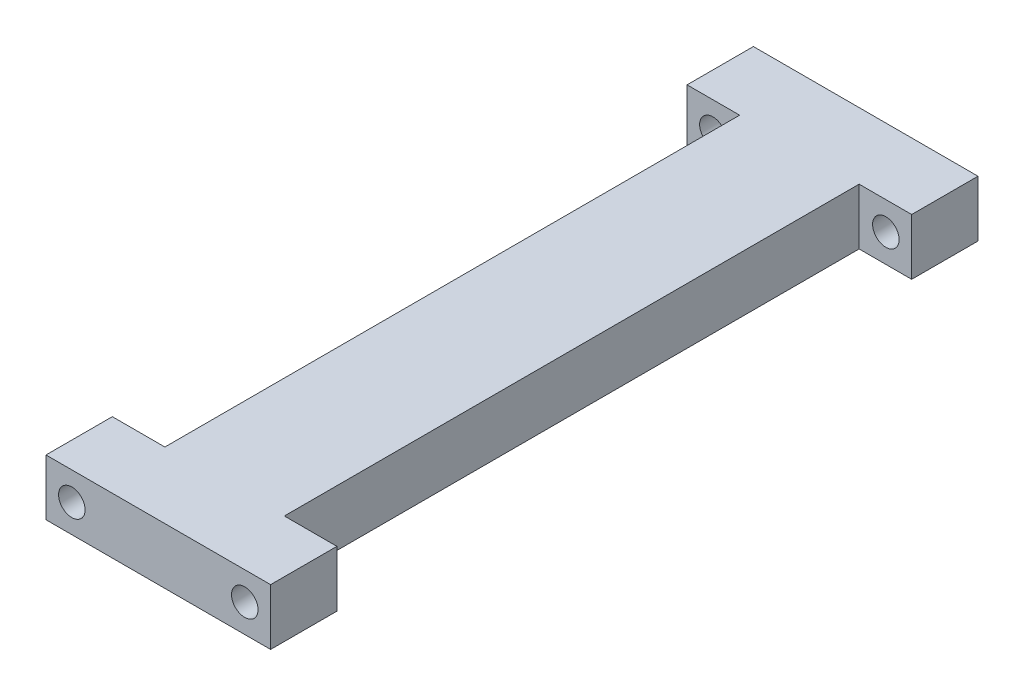
ISO-10303-21;
HEADER;
FILE_DESCRIPTION(('STEP AP214'),'2;1');
FILE_NAME('part.step','',(''),(''),'','','');
FILE_SCHEMA(('AUTOMOTIVE_DESIGN { 1 0 10303 214 1 1 1 1 }'));
ENDSEC;
DATA;
#1=APPLICATION_CONTEXT('core data for automotive mechanical design processes');
#2=APPLICATION_PROTOCOL_DEFINITION('international standard','automotive_design',2000,#1);
#3=PRODUCT_CONTEXT('',#1,'mechanical');
#4=PRODUCT('Part','Part','',(#3));
#5=PRODUCT_RELATED_PRODUCT_CATEGORY('part','',(#4));
#6=PRODUCT_DEFINITION_FORMATION('','',#4);
#7=PRODUCT_DEFINITION_CONTEXT('part definition',#1,'design');
#8=PRODUCT_DEFINITION('design','',#6,#7);
#9=PRODUCT_DEFINITION_SHAPE('','',#8);
#10=(LENGTH_UNIT() NAMED_UNIT(*) SI_UNIT(.MILLI.,.METRE.));
#11=(NAMED_UNIT(*) PLANE_ANGLE_UNIT() SI_UNIT($,.RADIAN.));
#12=(NAMED_UNIT(*) SI_UNIT($,.STERADIAN.) SOLID_ANGLE_UNIT());
#13=UNCERTAINTY_MEASURE_WITH_UNIT(LENGTH_MEASURE(1.E-05),#10,'distance_accuracy_value','');
#14=(GEOMETRIC_REPRESENTATION_CONTEXT(3) GLOBAL_UNCERTAINTY_ASSIGNED_CONTEXT((#13)) GLOBAL_UNIT_ASSIGNED_CONTEXT((#10,
#11,#12)) REPRESENTATION_CONTEXT('',''));
#15=CARTESIAN_POINT('',(0.,0.,0.));
#16=DIRECTION('',(0.,0.,1.));
#17=DIRECTION('',(1.,0.,0.));
#18=AXIS2_PLACEMENT_3D('',#15,#16,#17);
#19=CARTESIAN_POINT('',(-12.7,3.175,-40.));
#20=DIRECTION('',(1.,0.,0.));
#21=DIRECTION('',(0.,0.,-1.));
#22=AXIS2_PLACEMENT_3D('',#19,#20,#21);
#23=PLANE('',#22);
#24=DIRECTION('',(0.,0.,1.));
#25=VECTOR('',#24,1.);
#26=CARTESIAN_POINT('',(-12.7,-3.175,-40.));
#27=LINE('',#26,#25);
#28=CARTESIAN_POINT('',(-12.7,-3.175,-40.));
#29=VERTEX_POINT('',#28);
#30=CARTESIAN_POINT('',(-12.7,-3.175,-32.5));
#31=VERTEX_POINT('',#30);
#32=EDGE_CURVE('E164',#29,#31,#27,.T.);
#33=ORIENTED_EDGE('',*,*,#32,.T.);
#34=DIRECTION('',(0.,-1.,0.));
#35=VECTOR('',#34,1.);
#36=CARTESIAN_POINT('',(-12.7,3.175,-32.5));
#37=LINE('',#36,#35);
#38=CARTESIAN_POINT('',(-12.7,3.175,-32.5));
#39=VERTEX_POINT('',#38);
#40=EDGE_CURVE('E11',#39,#31,#37,.T.);
#41=ORIENTED_EDGE('',*,*,#40,.F.);
#42=DIRECTION('',(0.,0.,1.));
#43=VECTOR('',#42,1.);
#44=CARTESIAN_POINT('',(-12.7,3.175,-40.));
#45=LINE('',#44,#43);
#46=CARTESIAN_POINT('',(-12.7,3.175,-40.));
#47=VERTEX_POINT('',#46);
#48=EDGE_CURVE('E199',#47,#39,#45,.T.);
#49=ORIENTED_EDGE('',*,*,#48,.F.);
#50=DIRECTION('',(0.,-1.,0.));
#51=VECTOR('',#50,1.);
#52=CARTESIAN_POINT('',(-12.7,3.175,-40.));
#53=LINE('',#52,#51);
#54=EDGE_CURVE('E160',#47,#29,#53,.T.);
#55=ORIENTED_EDGE('',*,*,#54,.T.);
#56=EDGE_LOOP('',(#33,#41,#49,#55));
#57=FACE_BOUND('',#56,.T.);
#58=ADVANCED_FACE('F39',(#57),#23,.F.);
#59=CARTESIAN_POINT('',(-12.7,3.175,-32.5));
#60=DIRECTION('',(0.,0.,-1.));
#61=DIRECTION('',(-1.,0.,0.));
#62=AXIS2_PLACEMENT_3D('',#59,#60,#61);
#63=PLANE('',#62);
#64=CARTESIAN_POINT('',(-9.77900000000001,0.,-32.5));
#65=DIRECTION('',(0.,0.,-1.));
#66=DIRECTION('',(-1.,0.,0.));
#67=AXIS2_PLACEMENT_3D('',#64,#65,#66);
#68=CIRCLE('',#67,1.49999999999999);
#69=CARTESIAN_POINT('',(-11.279,0.,-32.5));
#70=VERTEX_POINT('',#69);
#71=EDGE_CURVE('E169',#70,#70,#68,.T.);
#72=ORIENTED_EDGE('',*,*,#71,.T.);
#73=EDGE_LOOP('',(#72));
#74=FACE_BOUND('',#73,.T.);
#75=DIRECTION('',(1.,0.,0.));
#76=VECTOR('',#75,1.);
#77=CARTESIAN_POINT('',(-12.7,-3.175,-32.5));
#78=LINE('',#77,#76);
#79=CARTESIAN_POINT('',(-6.75640000000002,-3.175,-32.5));
#80=VERTEX_POINT('',#79);
#81=EDGE_CURVE('E168',#31,#80,#78,.T.);
#82=ORIENTED_EDGE('',*,*,#81,.T.);
#83=DIRECTION('',(0.,-1.,0.));
#84=VECTOR('',#83,1.);
#85=CARTESIAN_POINT('',(-6.75640000000002,3.175,-32.5));
#86=LINE('',#85,#84);
#87=CARTESIAN_POINT('',(-6.75640000000002,3.175,-32.5));
#88=VERTEX_POINT('',#87);
#89=EDGE_CURVE('E48',#88,#80,#86,.T.);
#90=ORIENTED_EDGE('',*,*,#89,.F.);
#91=DIRECTION('',(1.,0.,0.));
#92=VECTOR('',#91,1.);
#93=CARTESIAN_POINT('',(-12.7,3.175,-32.5));
#94=LINE('',#93,#92);
#95=EDGE_CURVE('E111',#39,#88,#94,.T.);
#96=ORIENTED_EDGE('',*,*,#95,.F.);
#97=ORIENTED_EDGE('',*,*,#40,.T.);
#98=EDGE_LOOP('',(#82,#90,#96,#97));
#99=FACE_BOUND('',#98,.T.);
#100=ADVANCED_FACE('F296',(#74,#99),#63,.F.);
#101=CARTESIAN_POINT('',(-6.75640000000002,3.175,-32.5));
#102=DIRECTION('',(1.,0.,0.));
#103=DIRECTION('',(0.,0.,-1.));
#104=AXIS2_PLACEMENT_3D('',#101,#102,#103);
#105=PLANE('',#104);
#106=DIRECTION('',(0.,0.,1.));
#107=VECTOR('',#106,1.);
#108=CARTESIAN_POINT('',(-6.75640000000002,-3.175,-32.5));
#109=LINE('',#108,#107);
#110=CARTESIAN_POINT('',(-6.75640000000002,-3.175,32.5));
#111=VERTEX_POINT('',#110);
#112=EDGE_CURVE('E172',#80,#111,#109,.T.);
#113=ORIENTED_EDGE('',*,*,#112,.T.);
#114=DIRECTION('',(0.,-1.,0.));
#115=VECTOR('',#114,1.);
#116=CARTESIAN_POINT('',(-6.75640000000002,3.175,32.5));
#117=LINE('',#116,#115);
#118=CARTESIAN_POINT('',(-6.75640000000002,3.175,32.5));
#119=VERTEX_POINT('',#118);
#120=EDGE_CURVE('E226',#119,#111,#117,.T.);
#121=ORIENTED_EDGE('',*,*,#120,.F.);
#122=DIRECTION('',(0.,0.,1.));
#123=VECTOR('',#122,1.);
#124=CARTESIAN_POINT('',(-6.75640000000002,3.175,-32.5));
#125=LINE('',#124,#123);
#126=EDGE_CURVE('E236',#88,#119,#125,.T.);
#127=ORIENTED_EDGE('',*,*,#126,.F.);
#128=ORIENTED_EDGE('',*,*,#89,.T.);
#129=EDGE_LOOP('',(#113,#121,#127,#128));
#130=FACE_BOUND('',#129,.T.);
#131=ADVANCED_FACE('F234',(#130),#105,.F.);
#132=CARTESIAN_POINT('',(-12.7,3.175,32.5));
#133=DIRECTION('',(0.,0.,1.));
#134=DIRECTION('',(1.,0.,0.));
#135=AXIS2_PLACEMENT_3D('',#132,#133,#134);
#136=PLANE('',#135);
#137=CARTESIAN_POINT('',(-9.77900000000001,0.,32.5));
#138=DIRECTION('',(0.,0.,1.));
#139=DIRECTION('',(1.,0.,0.));
#140=AXIS2_PLACEMENT_3D('',#137,#138,#139);
#141=CIRCLE('',#140,1.49999999999999);
#142=CARTESIAN_POINT('',(-8.27900000000002,0.,32.5));
#143=VERTEX_POINT('',#142);
#144=EDGE_CURVE('E354',#143,#143,#141,.T.);
#145=ORIENTED_EDGE('',*,*,#144,.T.);
#146=EDGE_LOOP('',(#145));
#147=FACE_BOUND('',#146,.T.);
#148=DIRECTION('',(-1.,0.,0.));
#149=VECTOR('',#148,1.);
#150=CARTESIAN_POINT('',(-12.7,-3.175,32.5));
#151=LINE('',#150,#149);
#152=CARTESIAN_POINT('',(-12.7,-3.175,32.5));
#153=VERTEX_POINT('',#152);
#154=EDGE_CURVE('E175',#111,#153,#151,.T.);
#155=ORIENTED_EDGE('',*,*,#154,.T.);
#156=DIRECTION('',(0.,-1.,0.));
#157=VECTOR('',#156,1.);
#158=CARTESIAN_POINT('',(-12.7,3.175,32.5));
#159=LINE('',#158,#157);
#160=CARTESIAN_POINT('',(-12.7,3.175,32.5));
#161=VERTEX_POINT('',#160);
#162=EDGE_CURVE('E222',#161,#153,#159,.T.);
#163=ORIENTED_EDGE('',*,*,#162,.F.);
#164=DIRECTION('',(-1.,0.,0.));
#165=VECTOR('',#164,1.);
#166=CARTESIAN_POINT('',(-12.7,3.175,32.5));
#167=LINE('',#166,#165);
#168=EDGE_CURVE('E255',#119,#161,#167,.T.);
#169=ORIENTED_EDGE('',*,*,#168,.F.);
#170=ORIENTED_EDGE('',*,*,#120,.T.);
#171=EDGE_LOOP('',(#155,#163,#169,#170));
#172=FACE_BOUND('',#171,.T.);
#173=ADVANCED_FACE('F245',(#147,#172),#136,.F.);
#174=CARTESIAN_POINT('',(-12.7,3.175,32.5));
#175=DIRECTION('',(1.,0.,0.));
#176=DIRECTION('',(0.,0.,-1.));
#177=AXIS2_PLACEMENT_3D('',#174,#175,#176);
#178=PLANE('',#177);
#179=DIRECTION('',(0.,0.,1.));
#180=VECTOR('',#179,1.);
#181=CARTESIAN_POINT('',(-12.7,-3.175,32.5));
#182=LINE('',#181,#180);
#183=CARTESIAN_POINT('',(-12.7,-3.175,40.));
#184=VERTEX_POINT('',#183);
#185=EDGE_CURVE('E178',#153,#184,#182,.T.);
#186=ORIENTED_EDGE('',*,*,#185,.T.);
#187=DIRECTION('',(0.,-1.,0.));
#188=VECTOR('',#187,1.);
#189=CARTESIAN_POINT('',(-12.7,3.175,40.));
#190=LINE('',#189,#188);
#191=CARTESIAN_POINT('',(-12.7,3.175,40.));
#192=VERTEX_POINT('',#191);
#193=EDGE_CURVE('E218',#192,#184,#190,.T.);
#194=ORIENTED_EDGE('',*,*,#193,.F.);
#195=DIRECTION('',(0.,0.,1.));
#196=VECTOR('',#195,1.);
#197=CARTESIAN_POINT('',(-12.7,3.175,32.5));
#198=LINE('',#197,#196);
#199=EDGE_CURVE('E251',#161,#192,#198,.T.);
#200=ORIENTED_EDGE('',*,*,#199,.F.);
#201=ORIENTED_EDGE('',*,*,#162,.T.);
#202=EDGE_LOOP('',(#186,#194,#200,#201));
#203=FACE_BOUND('',#202,.T.);
#204=ADVANCED_FACE('F249',(#203),#178,.F.);
#205=CARTESIAN_POINT('',(-12.7,3.175,40.));
#206=DIRECTION('',(0.,0.,-1.));
#207=DIRECTION('',(-1.,0.,0.));
#208=AXIS2_PLACEMENT_3D('',#205,#206,#207);
#209=PLANE('',#208);
#210=CARTESIAN_POINT('',(9.77899999999999,0.,40.));
#211=DIRECTION('',(0.,0.,-1.));
#212=DIRECTION('',(-1.,0.,0.));
#213=AXIS2_PLACEMENT_3D('',#210,#211,#212);
#214=CIRCLE('',#213,1.49999999999998);
#215=CARTESIAN_POINT('',(8.27900000000001,0.,40.));
#216=VERTEX_POINT('',#215);
#217=EDGE_CURVE('E335',#216,#216,#214,.T.);
#218=ORIENTED_EDGE('',*,*,#217,.T.);
#219=EDGE_LOOP('',(#218));
#220=FACE_BOUND('',#219,.T.);
#221=CARTESIAN_POINT('',(-9.77900000000001,0.,40.));
#222=DIRECTION('',(0.,0.,-1.));
#223=DIRECTION('',(-1.,0.,0.));
#224=AXIS2_PLACEMENT_3D('',#221,#222,#223);
#225=CIRCLE('',#224,1.49999999999998);
#226=CARTESIAN_POINT('',(-11.279,0.,40.));
#227=VERTEX_POINT('',#226);
#228=EDGE_CURVE('E350',#227,#227,#225,.T.);
#229=ORIENTED_EDGE('',*,*,#228,.T.);
#230=EDGE_LOOP('',(#229));
#231=FACE_BOUND('',#230,.T.);
#232=DIRECTION('',(1.,0.,0.));
#233=VECTOR('',#232,1.);
#234=CARTESIAN_POINT('',(-12.7,-3.175,40.));
#235=LINE('',#234,#233);
#236=CARTESIAN_POINT('',(12.7,-3.175,40.));
#237=VERTEX_POINT('',#236);
#238=EDGE_CURVE('E181',#184,#237,#235,.T.);
#239=ORIENTED_EDGE('',*,*,#238,.T.);
#240=DIRECTION('',(0.,-1.,0.));
#241=VECTOR('',#240,1.);
#242=CARTESIAN_POINT('',(12.7,3.175,40.));
#243=LINE('',#242,#241);
#244=CARTESIAN_POINT('',(12.7,3.175,40.));
#245=VERTEX_POINT('',#244);
#246=EDGE_CURVE('E214',#245,#237,#243,.T.);
#247=ORIENTED_EDGE('',*,*,#246,.F.);
#248=DIRECTION('',(1.,0.,0.));
#249=VECTOR('',#248,1.);
#250=CARTESIAN_POINT('',(-12.7,3.175,40.));
#251=LINE('',#250,#249);
#252=EDGE_CURVE('E254',#192,#245,#251,.T.);
#253=ORIENTED_EDGE('',*,*,#252,.F.);
#254=ORIENTED_EDGE('',*,*,#193,.T.);
#255=EDGE_LOOP('',(#239,#247,#253,#254));
#256=FACE_BOUND('',#255,.T.);
#257=ADVANCED_FACE('F312',(#220,#231,#256),#209,.F.);
#258=CARTESIAN_POINT('',(12.7,3.175,32.5));
#259=DIRECTION('',(-1.,0.,0.));
#260=DIRECTION('',(0.,0.,1.));
#261=AXIS2_PLACEMENT_3D('',#258,#259,#260);
#262=PLANE('',#261);
#263=DIRECTION('',(0.,0.,-1.));
#264=VECTOR('',#263,1.);
#265=CARTESIAN_POINT('',(12.7,-3.175,32.5));
#266=LINE('',#265,#264);
#267=CARTESIAN_POINT('',(12.7,-3.175,32.5));
#268=VERTEX_POINT('',#267);
#269=EDGE_CURVE('E184',#237,#268,#266,.T.);
#270=ORIENTED_EDGE('',*,*,#269,.T.);
#271=DIRECTION('',(0.,-1.,0.));
#272=VECTOR('',#271,1.);
#273=CARTESIAN_POINT('',(12.7,3.175,32.5));
#274=LINE('',#273,#272);
#275=CARTESIAN_POINT('',(12.7,3.175,32.5));
#276=VERTEX_POINT('',#275);
#277=EDGE_CURVE('E210',#276,#268,#274,.T.);
#278=ORIENTED_EDGE('',*,*,#277,.F.);
#279=DIRECTION('',(0.,0.,-1.));
#280=VECTOR('',#279,1.);
#281=CARTESIAN_POINT('',(12.7,3.175,32.5));
#282=LINE('',#281,#280);
#283=EDGE_CURVE('E259',#245,#276,#282,.T.);
#284=ORIENTED_EDGE('',*,*,#283,.F.);
#285=ORIENTED_EDGE('',*,*,#246,.T.);
#286=EDGE_LOOP('',(#270,#278,#284,#285));
#287=FACE_BOUND('',#286,.T.);
#288=ADVANCED_FACE('F315',(#287),#262,.F.);
#289=CARTESIAN_POINT('',(12.7,3.175,32.5));
#290=DIRECTION('',(0.,0.,1.));
#291=DIRECTION('',(1.,0.,0.));
#292=AXIS2_PLACEMENT_3D('',#289,#290,#291);
#293=PLANE('',#292);
#294=CARTESIAN_POINT('',(9.77899999999999,0.,32.5));
#295=DIRECTION('',(0.,0.,1.));
#296=DIRECTION('',(1.,0.,0.));
#297=AXIS2_PLACEMENT_3D('',#294,#295,#296);
#298=CIRCLE('',#297,1.49999999999999);
#299=CARTESIAN_POINT('',(11.279,0.,32.5));
#300=VERTEX_POINT('',#299);
#301=EDGE_CURVE('E334',#300,#300,#298,.T.);
#302=ORIENTED_EDGE('',*,*,#301,.T.);
#303=EDGE_LOOP('',(#302));
#304=FACE_BOUND('',#303,.T.);
#305=DIRECTION('',(-1.,0.,0.));
#306=VECTOR('',#305,1.);
#307=CARTESIAN_POINT('',(12.7,-3.175,32.5));
#308=LINE('',#307,#306);
#309=CARTESIAN_POINT('',(6.75640000000002,-3.175,32.5));
#310=VERTEX_POINT('',#309);
#311=EDGE_CURVE('E187',#268,#310,#308,.T.);
#312=ORIENTED_EDGE('',*,*,#311,.T.);
#313=DIRECTION('',(0.,-1.,0.));
#314=VECTOR('',#313,1.);
#315=CARTESIAN_POINT('',(6.75640000000002,3.175,32.5));
#316=LINE('',#315,#314);
#317=CARTESIAN_POINT('',(6.75640000000002,3.175,32.5));
#318=VERTEX_POINT('',#317);
#319=EDGE_CURVE('E206',#318,#310,#316,.T.);
#320=ORIENTED_EDGE('',*,*,#319,.F.);
#321=DIRECTION('',(-1.,0.,0.));
#322=VECTOR('',#321,1.);
#323=CARTESIAN_POINT('',(12.7,3.175,32.5));
#324=LINE('',#323,#322);
#325=EDGE_CURVE('E266',#276,#318,#324,.T.);
#326=ORIENTED_EDGE('',*,*,#325,.F.);
#327=ORIENTED_EDGE('',*,*,#277,.T.);
#328=EDGE_LOOP('',(#312,#320,#326,#327));
#329=FACE_BOUND('',#328,.T.);
#330=ADVANCED_FACE('F274',(#304,#329),#293,.F.);
#331=CARTESIAN_POINT('',(6.75640000000002,3.175,-32.5));
#332=DIRECTION('',(-1.,0.,0.));
#333=DIRECTION('',(0.,0.,1.));
#334=AXIS2_PLACEMENT_3D('',#331,#332,#333);
#335=PLANE('',#334);
#336=DIRECTION('',(0.,0.,-1.));
#337=VECTOR('',#336,1.);
#338=CARTESIAN_POINT('',(6.75640000000002,-3.175,-32.5));
#339=LINE('',#338,#337);
#340=CARTESIAN_POINT('',(6.75640000000002,-3.175,-32.5));
#341=VERTEX_POINT('',#340);
#342=EDGE_CURVE('E190',#310,#341,#339,.T.);
#343=ORIENTED_EDGE('',*,*,#342,.T.);
#344=DIRECTION('',(0.,-1.,0.));
#345=VECTOR('',#344,1.);
#346=CARTESIAN_POINT('',(6.75640000000002,3.175,-32.5));
#347=LINE('',#346,#345);
#348=CARTESIAN_POINT('',(6.75640000000002,3.175,-32.5));
#349=VERTEX_POINT('',#348);
#350=EDGE_CURVE('E153',#349,#341,#347,.T.);
#351=ORIENTED_EDGE('',*,*,#350,.F.);
#352=DIRECTION('',(0.,0.,-1.));
#353=VECTOR('',#352,1.);
#354=CARTESIAN_POINT('',(6.75640000000002,3.175,-32.5));
#355=LINE('',#354,#353);
#356=EDGE_CURVE('E142',#318,#349,#355,.T.);
#357=ORIENTED_EDGE('',*,*,#356,.F.);
#358=ORIENTED_EDGE('',*,*,#319,.T.);
#359=EDGE_LOOP('',(#343,#351,#357,#358));
#360=FACE_BOUND('',#359,.T.);
#361=ADVANCED_FACE('F278',(#360),#335,.F.);
#362=CARTESIAN_POINT('',(12.7,3.175,-32.5));
#363=DIRECTION('',(0.,0.,-1.));
#364=DIRECTION('',(-1.,0.,0.));
#365=AXIS2_PLACEMENT_3D('',#362,#363,#364);
#366=PLANE('',#365);
#367=CARTESIAN_POINT('',(9.77899999999999,0.,-32.5));
#368=DIRECTION('',(0.,0.,-1.));
#369=DIRECTION('',(-1.,0.,0.));
#370=AXIS2_PLACEMENT_3D('',#367,#368,#369);
#371=CIRCLE('',#370,1.49999999999999);
#372=CARTESIAN_POINT('',(8.279,0.,-32.5));
#373=VERTEX_POINT('',#372);
#374=EDGE_CURVE('E331',#373,#373,#371,.T.);
#375=ORIENTED_EDGE('',*,*,#374,.T.);
#376=EDGE_LOOP('',(#375));
#377=FACE_BOUND('',#376,.T.);
#378=DIRECTION('',(1.,0.,0.));
#379=VECTOR('',#378,1.);
#380=CARTESIAN_POINT('',(12.7,-3.175,-32.5));
#381=LINE('',#380,#379);
#382=CARTESIAN_POINT('',(12.7,-3.175,-32.5));
#383=VERTEX_POINT('',#382);
#384=EDGE_CURVE('E151',#341,#383,#381,.T.);
#385=ORIENTED_EDGE('',*,*,#384,.T.);
#386=DIRECTION('',(0.,-1.,0.));
#387=VECTOR('',#386,1.);
#388=CARTESIAN_POINT('',(12.7,3.175,-32.5));
#389=LINE('',#388,#387);
#390=CARTESIAN_POINT('',(12.7,3.175,-32.5));
#391=VERTEX_POINT('',#390);
#392=EDGE_CURVE('E148',#391,#383,#389,.T.);
#393=ORIENTED_EDGE('',*,*,#392,.F.);
#394=DIRECTION('',(1.,0.,0.));
#395=VECTOR('',#394,1.);
#396=CARTESIAN_POINT('',(12.7,3.175,-32.5));
#397=LINE('',#396,#395);
#398=EDGE_CURVE('E136',#349,#391,#397,.T.);
#399=ORIENTED_EDGE('',*,*,#398,.F.);
#400=ORIENTED_EDGE('',*,*,#350,.T.);
#401=EDGE_LOOP('',(#385,#393,#399,#400));
#402=FACE_BOUND('',#401,.T.);
#403=ADVANCED_FACE('F149',(#377,#402),#366,.F.);
#404=CARTESIAN_POINT('',(12.7,3.175,-40.));
#405=DIRECTION('',(-1.,0.,0.));
#406=DIRECTION('',(0.,0.,1.));
#407=AXIS2_PLACEMENT_3D('',#404,#405,#406);
#408=PLANE('',#407);
#409=DIRECTION('',(0.,0.,-1.));
#410=VECTOR('',#409,1.);
#411=CARTESIAN_POINT('',(12.7,-3.175,-40.));
#412=LINE('',#411,#410);
#413=CARTESIAN_POINT('',(12.7,-3.175,-40.));
#414=VERTEX_POINT('',#413);
#415=EDGE_CURVE('E97',#383,#414,#412,.T.);
#416=ORIENTED_EDGE('',*,*,#415,.T.);
#417=DIRECTION('',(0.,-1.,0.));
#418=VECTOR('',#417,1.);
#419=CARTESIAN_POINT('',(12.7,3.175,-40.));
#420=LINE('',#419,#418);
#421=CARTESIAN_POINT('',(12.7,3.175,-40.));
#422=VERTEX_POINT('',#421);
#423=EDGE_CURVE('E154',#422,#414,#420,.T.);
#424=ORIENTED_EDGE('',*,*,#423,.F.);
#425=DIRECTION('',(0.,0.,-1.));
#426=VECTOR('',#425,1.);
#427=CARTESIAN_POINT('',(12.7,3.175,-40.));
#428=LINE('',#427,#426);
#429=EDGE_CURVE('E140',#391,#422,#428,.T.);
#430=ORIENTED_EDGE('',*,*,#429,.F.);
#431=ORIENTED_EDGE('',*,*,#392,.T.);
#432=EDGE_LOOP('',(#416,#424,#430,#431));
#433=FACE_BOUND('',#432,.T.);
#434=ADVANCED_FACE('F156',(#433),#408,.F.);
#435=CARTESIAN_POINT('',(-12.7,3.175,-40.));
#436=DIRECTION('',(0.,0.,1.));
#437=DIRECTION('',(1.,0.,0.));
#438=AXIS2_PLACEMENT_3D('',#435,#436,#437);
#439=PLANE('',#438);
#440=CARTESIAN_POINT('',(9.77899999999999,0.,-40.));
#441=DIRECTION('',(0.,0.,-1.));
#442=DIRECTION('',(-1.,0.,0.));
#443=AXIS2_PLACEMENT_3D('',#440,#441,#442);
#444=CIRCLE('',#443,1.5);
#445=CARTESIAN_POINT('',(8.27899999999999,0.,-40.));
#446=VERTEX_POINT('',#445);
#447=EDGE_CURVE('E343',#446,#446,#444,.T.);
#448=ORIENTED_EDGE('',*,*,#447,.F.);
#449=EDGE_LOOP('',(#448));
#450=FACE_BOUND('',#449,.T.);
#451=CARTESIAN_POINT('',(-9.77900000000001,0.,-40.));
#452=DIRECTION('',(0.,0.,-1.));
#453=DIRECTION('',(-1.,0.,0.));
#454=AXIS2_PLACEMENT_3D('',#451,#452,#453);
#455=CIRCLE('',#454,1.5);
#456=CARTESIAN_POINT('',(-11.279,0.,-40.));
#457=VERTEX_POINT('',#456);
#458=EDGE_CURVE('E340',#457,#457,#455,.T.);
#459=ORIENTED_EDGE('',*,*,#458,.F.);
#460=EDGE_LOOP('',(#459));
#461=FACE_BOUND('',#460,.T.);
#462=DIRECTION('',(-1.,0.,0.));
#463=VECTOR('',#462,1.);
#464=CARTESIAN_POINT('',(-12.7,-3.175,-40.));
#465=LINE('',#464,#463);
#466=EDGE_CURVE('E103',#414,#29,#465,.T.);
#467=ORIENTED_EDGE('',*,*,#466,.T.);
#468=ORIENTED_EDGE('',*,*,#54,.F.);
#469=DIRECTION('',(-1.,0.,0.));
#470=VECTOR('',#469,1.);
#471=CARTESIAN_POINT('',(-12.7,3.175,-40.));
#472=LINE('',#471,#470);
#473=EDGE_CURVE('E56',#422,#47,#472,.T.);
#474=ORIENTED_EDGE('',*,*,#473,.F.);
#475=ORIENTED_EDGE('',*,*,#423,.T.);
#476=EDGE_LOOP('',(#467,#468,#474,#475));
#477=FACE_BOUND('',#476,.T.);
#478=ADVANCED_FACE('F282',(#450,#461,#477),#439,.F.);
#479=CARTESIAN_POINT('',(0.,3.175,0.));
#480=DIRECTION('',(0.,1.,0.));
#481=DIRECTION('',(0.,0.,1.));
#482=AXIS2_PLACEMENT_3D('',#479,#480,#481);
#483=PLANE('',#482);
#484=ORIENTED_EDGE('',*,*,#48,.T.);
#485=ORIENTED_EDGE('',*,*,#95,.T.);
#486=ORIENTED_EDGE('',*,*,#126,.T.);
#487=ORIENTED_EDGE('',*,*,#168,.T.);
#488=ORIENTED_EDGE('',*,*,#199,.T.);
#489=ORIENTED_EDGE('',*,*,#252,.T.);
#490=ORIENTED_EDGE('',*,*,#283,.T.);
#491=ORIENTED_EDGE('',*,*,#325,.T.);
#492=ORIENTED_EDGE('',*,*,#356,.T.);
#493=ORIENTED_EDGE('',*,*,#398,.T.);
#494=ORIENTED_EDGE('',*,*,#429,.T.);
#495=ORIENTED_EDGE('',*,*,#473,.T.);
#496=EDGE_LOOP('',(#484,#485,#486,#487,#488,#489,#490,#491,#492,#493,#494,#495));
#497=FACE_BOUND('',#496,.T.);
#498=ADVANCED_FACE('F138',(#497),#483,.T.);
#499=CARTESIAN_POINT('',(0.,-3.175,0.));
#500=DIRECTION('',(0.,1.,0.));
#501=DIRECTION('',(0.,0.,1.));
#502=AXIS2_PLACEMENT_3D('',#499,#500,#501);
#503=PLANE('',#502);
#504=ORIENTED_EDGE('',*,*,#32,.F.);
#505=ORIENTED_EDGE('',*,*,#466,.F.);
#506=ORIENTED_EDGE('',*,*,#415,.F.);
#507=ORIENTED_EDGE('',*,*,#384,.F.);
#508=ORIENTED_EDGE('',*,*,#342,.F.);
#509=ORIENTED_EDGE('',*,*,#311,.F.);
#510=ORIENTED_EDGE('',*,*,#269,.F.);
#511=ORIENTED_EDGE('',*,*,#238,.F.);
#512=ORIENTED_EDGE('',*,*,#185,.F.);
#513=ORIENTED_EDGE('',*,*,#154,.F.);
#514=ORIENTED_EDGE('',*,*,#112,.F.);
#515=ORIENTED_EDGE('',*,*,#81,.F.);
#516=EDGE_LOOP('',(#504,#505,#506,#507,#508,#509,#510,#511,#512,#513,#514,#515));
#517=FACE_BOUND('',#516,.T.);
#518=ADVANCED_FACE('F240',(#517),#503,.F.);
#519=CARTESIAN_POINT('',(-9.77900000000001,0.,-40.));
#520=DIRECTION('',(0.,0.,-1.));
#521=DIRECTION('',(-1.,0.,0.));
#522=AXIS2_PLACEMENT_3D('',#519,#520,#521);
#523=CYLINDRICAL_SURFACE('',#522,1.49999999999999);
#524=ORIENTED_EDGE('',*,*,#458,.T.);
#525=EDGE_LOOP('',(#524));
#526=FACE_BOUND('',#525,.T.);
#527=ORIENTED_EDGE('',*,*,#71,.F.);
#528=EDGE_LOOP('',(#527));
#529=FACE_BOUND('',#528,.T.);
#530=ADVANCED_FACE('F366',(#526,#529),#523,.F.);
#531=ORIENTED_EDGE('',*,*,#228,.F.);
#532=EDGE_LOOP('',(#531));
#533=FACE_BOUND('',#532,.T.);
#534=ORIENTED_EDGE('',*,*,#144,.F.);
#535=EDGE_LOOP('',(#534));
#536=FACE_BOUND('',#535,.T.);
#537=ADVANCED_FACE('F368',(#533,#536),#523,.F.);
#538=CARTESIAN_POINT('',(9.77899999999999,0.,-40.));
#539=DIRECTION('',(0.,0.,-1.));
#540=DIRECTION('',(-1.,0.,0.));
#541=AXIS2_PLACEMENT_3D('',#538,#539,#540);
#542=CYLINDRICAL_SURFACE('',#541,1.49999999999999);
#543=ORIENTED_EDGE('',*,*,#447,.T.);
#544=EDGE_LOOP('',(#543));
#545=FACE_BOUND('',#544,.T.);
#546=ORIENTED_EDGE('',*,*,#374,.F.);
#547=EDGE_LOOP('',(#546));
#548=FACE_BOUND('',#547,.T.);
#549=ADVANCED_FACE('F375',(#545,#548),#542,.F.);
#550=ORIENTED_EDGE('',*,*,#217,.F.);
#551=EDGE_LOOP('',(#550));
#552=FACE_BOUND('',#551,.T.);
#553=ORIENTED_EDGE('',*,*,#301,.F.);
#554=EDGE_LOOP('',(#553));
#555=FACE_BOUND('',#554,.T.);
#556=ADVANCED_FACE('F378',(#552,#555),#542,.F.);
#557=CLOSED_SHELL('',(#58,#100,#131,#173,#204,#257,#288,#330,#361,#403,#434,#478,#498,#518,#530,
#537,#549,#556));
#558=MANIFOLD_SOLID_BREP('B2',#557);
#559=ADVANCED_BREP_SHAPE_REPRESENTATION('',(#18,#558),#14);
#560=SHAPE_DEFINITION_REPRESENTATION(#9,#559);
ENDSEC;
END-ISO-10303-21;
